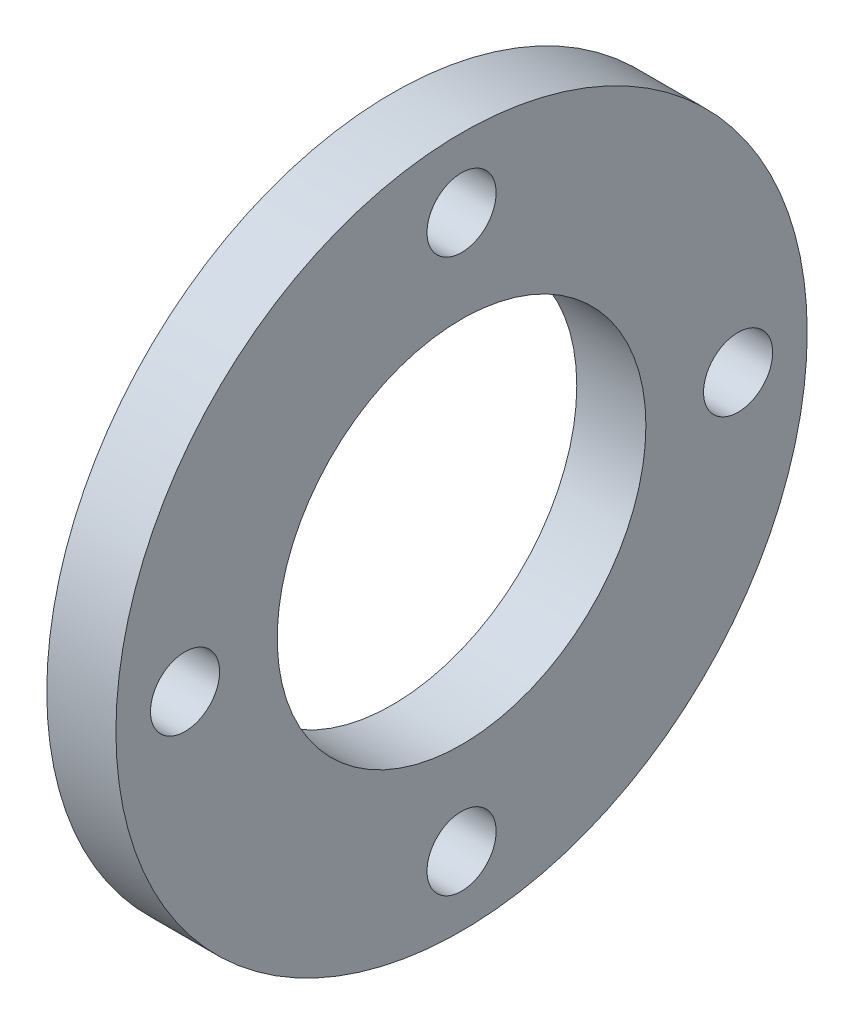
ISO-10303-21;
HEADER;
FILE_DESCRIPTION(('STEP AP214'),'2;1');
FILE_NAME('part.step','',(''),(''),'','','');
FILE_SCHEMA(('AUTOMOTIVE_DESIGN { 1 0 10303 214 1 1 1 1 }'));
ENDSEC;
DATA;
#1=APPLICATION_CONTEXT('core data for automotive mechanical design processes');
#2=APPLICATION_PROTOCOL_DEFINITION('international standard','automotive_design',2000,#1);
#3=PRODUCT_CONTEXT('',#1,'mechanical');
#4=PRODUCT('Part','Part','',(#3));
#5=PRODUCT_RELATED_PRODUCT_CATEGORY('part','',(#4));
#6=PRODUCT_DEFINITION_FORMATION('','',#4);
#7=PRODUCT_DEFINITION_CONTEXT('part definition',#1,'design');
#8=PRODUCT_DEFINITION('design','',#6,#7);
#9=PRODUCT_DEFINITION_SHAPE('','',#8);
#10=(LENGTH_UNIT() NAMED_UNIT(*) SI_UNIT(.MILLI.,.METRE.));
#11=(NAMED_UNIT(*) PLANE_ANGLE_UNIT() SI_UNIT($,.RADIAN.));
#12=(NAMED_UNIT(*) SI_UNIT($,.STERADIAN.) SOLID_ANGLE_UNIT());
#13=UNCERTAINTY_MEASURE_WITH_UNIT(LENGTH_MEASURE(1.E-05),#10,'distance_accuracy_value','');
#14=(GEOMETRIC_REPRESENTATION_CONTEXT(3) GLOBAL_UNCERTAINTY_ASSIGNED_CONTEXT((#13)) GLOBAL_UNIT_ASSIGNED_CONTEXT((#10,
#11,#12)) REPRESENTATION_CONTEXT('',''));
#15=CARTESIAN_POINT('',(0.,0.,0.));
#16=DIRECTION('',(0.,0.,1.));
#17=DIRECTION('',(1.,0.,0.));
#18=AXIS2_PLACEMENT_3D('',#15,#16,#17);
#19=CARTESIAN_POINT('',(3.,0.,0.));
#20=DIRECTION('',(1.,0.,0.));
#21=DIRECTION('',(0.,0.,-1.));
#22=AXIS2_PLACEMENT_3D('',#19,#20,#21);
#23=PLANE('',#22);
#24=CARTESIAN_POINT('',(3.,-12.,0.));
#25=DIRECTION('',(1.,0.,0.));
#26=DIRECTION('',(0.,0.,-1.));
#27=AXIS2_PLACEMENT_3D('',#24,#25,#26);
#28=CIRCLE('',#27,1.5);
#29=CARTESIAN_POINT('',(3.,-12.,-1.49999999999992));
#30=VERTEX_POINT('',#29);
#31=EDGE_CURVE('E65',#30,#30,#28,.T.);
#32=ORIENTED_EDGE('',*,*,#31,.F.);
#33=EDGE_LOOP('',(#32));
#34=FACE_BOUND('',#33,.T.);
#35=CARTESIAN_POINT('',(3.,12.,0.));
#36=DIRECTION('',(1.,0.,0.));
#37=DIRECTION('',(0.,0.,-1.));
#38=AXIS2_PLACEMENT_3D('',#35,#36,#37);
#39=CIRCLE('',#38,1.5);
#40=CARTESIAN_POINT('',(3.,12.,-1.5));
#41=VERTEX_POINT('',#40);
#42=EDGE_CURVE('E53',#41,#41,#39,.T.);
#43=ORIENTED_EDGE('',*,*,#42,.F.);
#44=EDGE_LOOP('',(#43));
#45=FACE_BOUND('',#44,.T.);
#46=CARTESIAN_POINT('',(3.,0.,0.));
#47=DIRECTION('',(1.,0.,0.));
#48=DIRECTION('',(0.,0.,-1.));
#49=AXIS2_PLACEMENT_3D('',#46,#47,#48);
#50=CIRCLE('',#49,15.);
#51=CARTESIAN_POINT('',(3.,0.,-15.));
#52=VERTEX_POINT('',#51);
#53=EDGE_CURVE('E10',#52,#52,#50,.T.);
#54=ORIENTED_EDGE('',*,*,#53,.T.);
#55=EDGE_LOOP('',(#54));
#56=FACE_BOUND('',#55,.T.);
#57=CARTESIAN_POINT('',(3.,0.,0.));
#58=DIRECTION('',(1.,0.,0.));
#59=DIRECTION('',(0.,0.,-1.));
#60=AXIS2_PLACEMENT_3D('',#57,#58,#59);
#61=CIRCLE('',#60,8.);
#62=CARTESIAN_POINT('',(3.,0.,-8.));
#63=VERTEX_POINT('',#62);
#64=EDGE_CURVE('E48',#63,#63,#61,.T.);
#65=ORIENTED_EDGE('',*,*,#64,.F.);
#66=EDGE_LOOP('',(#65));
#67=FACE_BOUND('',#66,.T.);
#68=CARTESIAN_POINT('',(3.,0.,-12.));
#69=DIRECTION('',(1.,0.,0.));
#70=DIRECTION('',(0.,0.,-1.));
#71=AXIS2_PLACEMENT_3D('',#68,#69,#70);
#72=CIRCLE('',#71,1.5);
#73=CARTESIAN_POINT('',(3.,0.,-13.5));
#74=VERTEX_POINT('',#73);
#75=EDGE_CURVE('E59',#74,#74,#72,.T.);
#76=ORIENTED_EDGE('',*,*,#75,.F.);
#77=EDGE_LOOP('',(#76));
#78=FACE_BOUND('',#77,.T.);
#79=CARTESIAN_POINT('',(3.,1.25693328198353E-13,12.));
#80=DIRECTION('',(1.,0.,0.));
#81=DIRECTION('',(0.,0.,-1.));
#82=AXIS2_PLACEMENT_3D('',#79,#80,#81);
#83=CIRCLE('',#82,1.5);
#84=CARTESIAN_POINT('',(3.,1.25693328198353E-13,10.5));
#85=VERTEX_POINT('',#84);
#86=EDGE_CURVE('E71',#85,#85,#83,.T.);
#87=ORIENTED_EDGE('',*,*,#86,.F.);
#88=EDGE_LOOP('',(#87));
#89=FACE_BOUND('',#88,.T.);
#90=ADVANCED_FACE('F37',(#34,#45,#56,#67,#78,#89),#23,.T.);
#91=CARTESIAN_POINT('',(0.,0.,0.));
#92=DIRECTION('',(1.,0.,0.));
#93=DIRECTION('',(0.,0.,-1.));
#94=AXIS2_PLACEMENT_3D('',#91,#92,#93);
#95=PLANE('',#94);
#96=CARTESIAN_POINT('',(0.,0.,0.));
#97=DIRECTION('',(1.,0.,0.));
#98=DIRECTION('',(0.,0.,-1.));
#99=AXIS2_PLACEMENT_3D('',#96,#97,#98);
#100=CIRCLE('',#99,15.);
#101=CARTESIAN_POINT('',(0.,0.,-15.));
#102=VERTEX_POINT('',#101);
#103=EDGE_CURVE('E41',#102,#102,#100,.T.);
#104=ORIENTED_EDGE('',*,*,#103,.F.);
#105=EDGE_LOOP('',(#104));
#106=FACE_BOUND('',#105,.T.);
#107=CARTESIAN_POINT('',(0.,0.,0.));
#108=DIRECTION('',(1.,0.,0.));
#109=DIRECTION('',(0.,0.,-1.));
#110=AXIS2_PLACEMENT_3D('',#107,#108,#109);
#111=CIRCLE('',#110,8.);
#112=CARTESIAN_POINT('',(0.,0.,-8.));
#113=VERTEX_POINT('',#112);
#114=EDGE_CURVE('E50',#113,#113,#111,.T.);
#115=ORIENTED_EDGE('',*,*,#114,.T.);
#116=EDGE_LOOP('',(#115));
#117=FACE_BOUND('',#116,.T.);
#118=CARTESIAN_POINT('',(0.,12.,0.));
#119=DIRECTION('',(1.,0.,0.));
#120=DIRECTION('',(0.,0.,-1.));
#121=AXIS2_PLACEMENT_3D('',#118,#119,#120);
#122=CIRCLE('',#121,1.5);
#123=CARTESIAN_POINT('',(0.,12.,-1.5));
#124=VERTEX_POINT('',#123);
#125=EDGE_CURVE('E56',#124,#124,#122,.T.);
#126=ORIENTED_EDGE('',*,*,#125,.T.);
#127=EDGE_LOOP('',(#126));
#128=FACE_BOUND('',#127,.T.);
#129=CARTESIAN_POINT('',(0.,0.,-12.));
#130=DIRECTION('',(1.,0.,0.));
#131=DIRECTION('',(0.,0.,-1.));
#132=AXIS2_PLACEMENT_3D('',#129,#130,#131);
#133=CIRCLE('',#132,1.5);
#134=CARTESIAN_POINT('',(0.,0.,-13.5));
#135=VERTEX_POINT('',#134);
#136=EDGE_CURVE('E62',#135,#135,#133,.T.);
#137=ORIENTED_EDGE('',*,*,#136,.T.);
#138=EDGE_LOOP('',(#137));
#139=FACE_BOUND('',#138,.T.);
#140=CARTESIAN_POINT('',(0.,-12.,0.));
#141=DIRECTION('',(1.,0.,0.));
#142=DIRECTION('',(0.,0.,-1.));
#143=AXIS2_PLACEMENT_3D('',#140,#141,#142);
#144=CIRCLE('',#143,1.5);
#145=CARTESIAN_POINT('',(0.,-12.,-1.49999999999992));
#146=VERTEX_POINT('',#145);
#147=EDGE_CURVE('E68',#146,#146,#144,.T.);
#148=ORIENTED_EDGE('',*,*,#147,.T.);
#149=EDGE_LOOP('',(#148));
#150=FACE_BOUND('',#149,.T.);
#151=CARTESIAN_POINT('',(0.,1.25693328198353E-13,12.));
#152=DIRECTION('',(1.,0.,0.));
#153=DIRECTION('',(0.,0.,-1.));
#154=AXIS2_PLACEMENT_3D('',#151,#152,#153);
#155=CIRCLE('',#154,1.5);
#156=CARTESIAN_POINT('',(0.,1.25693328198353E-13,10.5));
#157=VERTEX_POINT('',#156);
#158=EDGE_CURVE('E74',#157,#157,#155,.T.);
#159=ORIENTED_EDGE('',*,*,#158,.T.);
#160=EDGE_LOOP('',(#159));
#161=FACE_BOUND('',#160,.T.);
#162=ADVANCED_FACE('F84',(#106,#117,#128,#139,#150,#161),#95,.F.);
#163=CARTESIAN_POINT('',(3.,0.,0.));
#164=DIRECTION('',(-1.,0.,0.));
#165=DIRECTION('',(0.,0.,1.));
#166=AXIS2_PLACEMENT_3D('',#163,#164,#165);
#167=CYLINDRICAL_SURFACE('',#166,15.);
#168=ORIENTED_EDGE('',*,*,#53,.F.);
#169=EDGE_LOOP('',(#168));
#170=FACE_BOUND('',#169,.T.);
#171=ORIENTED_EDGE('',*,*,#103,.T.);
#172=EDGE_LOOP('',(#171));
#173=FACE_BOUND('',#172,.T.);
#174=ADVANCED_FACE('F39',(#170,#173),#167,.T.);
#175=CARTESIAN_POINT('',(3.,0.,0.));
#176=DIRECTION('',(-1.,0.,0.));
#177=DIRECTION('',(0.,0.,1.));
#178=AXIS2_PLACEMENT_3D('',#175,#176,#177);
#179=CYLINDRICAL_SURFACE('',#178,8.);
#180=ORIENTED_EDGE('',*,*,#64,.T.);
#181=EDGE_LOOP('',(#180));
#182=FACE_BOUND('',#181,.T.);
#183=ORIENTED_EDGE('',*,*,#114,.F.);
#184=EDGE_LOOP('',(#183));
#185=FACE_BOUND('',#184,.T.);
#186=ADVANCED_FACE('F94',(#182,#185),#179,.F.);
#187=CARTESIAN_POINT('',(3.,12.,0.));
#188=DIRECTION('',(-1.,0.,0.));
#189=DIRECTION('',(0.,0.,1.));
#190=AXIS2_PLACEMENT_3D('',#187,#188,#189);
#191=CYLINDRICAL_SURFACE('',#190,1.5);
#192=ORIENTED_EDGE('',*,*,#42,.T.);
#193=EDGE_LOOP('',(#192));
#194=FACE_BOUND('',#193,.T.);
#195=ORIENTED_EDGE('',*,*,#125,.F.);
#196=EDGE_LOOP('',(#195));
#197=FACE_BOUND('',#196,.T.);
#198=ADVANCED_FACE('F97',(#194,#197),#191,.F.);
#199=CARTESIAN_POINT('',(3.,0.,-12.));
#200=DIRECTION('',(-1.,0.,0.));
#201=DIRECTION('',(0.,0.,1.));
#202=AXIS2_PLACEMENT_3D('',#199,#200,#201);
#203=CYLINDRICAL_SURFACE('',#202,1.5);
#204=ORIENTED_EDGE('',*,*,#75,.T.);
#205=EDGE_LOOP('',(#204));
#206=FACE_BOUND('',#205,.T.);
#207=ORIENTED_EDGE('',*,*,#136,.F.);
#208=EDGE_LOOP('',(#207));
#209=FACE_BOUND('',#208,.T.);
#210=ADVANCED_FACE('F101',(#206,#209),#203,.F.);
#211=CARTESIAN_POINT('',(3.,-12.,0.));
#212=DIRECTION('',(-1.,0.,0.));
#213=DIRECTION('',(0.,0.,1.));
#214=AXIS2_PLACEMENT_3D('',#211,#212,#213);
#215=CYLINDRICAL_SURFACE('',#214,1.5);
#216=ORIENTED_EDGE('',*,*,#31,.T.);
#217=EDGE_LOOP('',(#216));
#218=FACE_BOUND('',#217,.T.);
#219=ORIENTED_EDGE('',*,*,#147,.F.);
#220=EDGE_LOOP('',(#219));
#221=FACE_BOUND('',#220,.T.);
#222=ADVANCED_FACE('F105',(#218,#221),#215,.F.);
#223=CARTESIAN_POINT('',(3.,1.25693328198353E-13,12.));
#224=DIRECTION('',(-1.,0.,0.));
#225=DIRECTION('',(0.,0.,1.));
#226=AXIS2_PLACEMENT_3D('',#223,#224,#225);
#227=CYLINDRICAL_SURFACE('',#226,1.5);
#228=ORIENTED_EDGE('',*,*,#86,.T.);
#229=EDGE_LOOP('',(#228));
#230=FACE_BOUND('',#229,.T.);
#231=ORIENTED_EDGE('',*,*,#158,.F.);
#232=EDGE_LOOP('',(#231));
#233=FACE_BOUND('',#232,.T.);
#234=ADVANCED_FACE('F80',(#230,#233),#227,.F.);
#235=CLOSED_SHELL('',(#90,#162,#174,#186,#198,#210,#222,#234));
#236=MANIFOLD_SOLID_BREP('B2',#235);
#237=ADVANCED_BREP_SHAPE_REPRESENTATION('',(#18,#236),#14);
#238=SHAPE_DEFINITION_REPRESENTATION(#9,#237);
ENDSEC;
END-ISO-10303-21;
